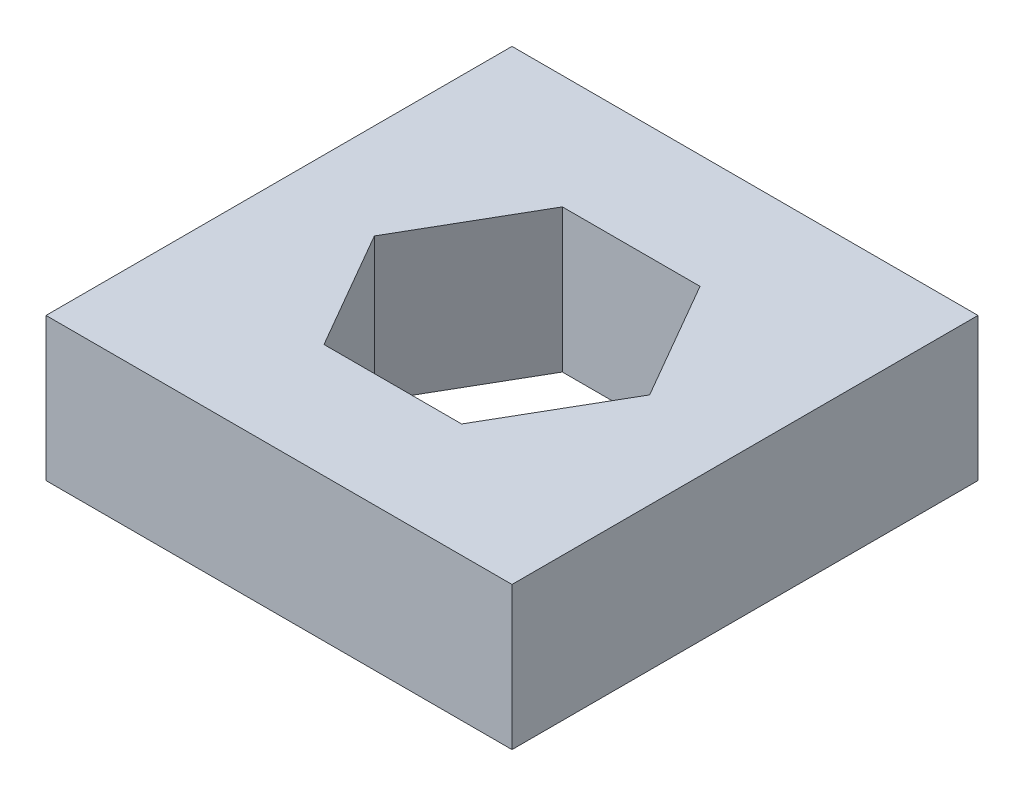
ISO-10303-21;
HEADER;
FILE_DESCRIPTION(('STEP AP214'),'2;1');
FILE_NAME('part.step','',(''),(''),'','','');
FILE_SCHEMA(('AUTOMOTIVE_DESIGN { 1 0 10303 214 1 1 1 1 }'));
ENDSEC;
DATA;
#1=APPLICATION_CONTEXT('core data for automotive mechanical design processes');
#2=APPLICATION_PROTOCOL_DEFINITION('international standard','automotive_design',2000,#1);
#3=PRODUCT_CONTEXT('',#1,'mechanical');
#4=PRODUCT('Part','Part','',(#3));
#5=PRODUCT_RELATED_PRODUCT_CATEGORY('part','',(#4));
#6=PRODUCT_DEFINITION_FORMATION('','',#4);
#7=PRODUCT_DEFINITION_CONTEXT('part definition',#1,'design');
#8=PRODUCT_DEFINITION('design','',#6,#7);
#9=PRODUCT_DEFINITION_SHAPE('','',#8);
#10=(LENGTH_UNIT() NAMED_UNIT(*) SI_UNIT(.MILLI.,.METRE.));
#11=(NAMED_UNIT(*) PLANE_ANGLE_UNIT() SI_UNIT($,.RADIAN.));
#12=(NAMED_UNIT(*) SI_UNIT($,.STERADIAN.) SOLID_ANGLE_UNIT());
#13=UNCERTAINTY_MEASURE_WITH_UNIT(LENGTH_MEASURE(1.E-05),#10,'distance_accuracy_value','');
#14=(GEOMETRIC_REPRESENTATION_CONTEXT(3) GLOBAL_UNCERTAINTY_ASSIGNED_CONTEXT((#13)) GLOBAL_UNIT_ASSIGNED_CONTEXT((#10,
#11,#12)) REPRESENTATION_CONTEXT('',''));
#15=CARTESIAN_POINT('',(0.,0.,0.));
#16=DIRECTION('',(0.,0.,1.));
#17=DIRECTION('',(1.,0.,0.));
#18=AXIS2_PLACEMENT_3D('',#15,#16,#17);
#19=CARTESIAN_POINT('',(0.,3.,0.));
#20=DIRECTION('',(0.,-1.,0.));
#21=DIRECTION('',(0.,0.,-1.));
#22=AXIS2_PLACEMENT_3D('',#19,#20,#21);
#23=PLANE('',#22);
#24=DIRECTION('',(0.,0.,-1.));
#25=VECTOR('',#24,1.);
#26=CARTESIAN_POINT('',(4.88675134594813,3.,4.88675134594813));
#27=LINE('',#26,#25);
#28=CARTESIAN_POINT('',(4.88675134594813,3.,4.88675134594813));
#29=VERTEX_POINT('',#28);
#30=CARTESIAN_POINT('',(4.88675134594813,3.,-4.88675134594813));
#31=VERTEX_POINT('',#30);
#32=EDGE_CURVE('E161',#29,#31,#27,.T.);
#33=ORIENTED_EDGE('',*,*,#32,.T.);
#34=DIRECTION('',(-1.,0.,0.));
#35=VECTOR('',#34,1.);
#36=CARTESIAN_POINT('',(-4.88675134594813,3.,-4.88675134594813));
#37=LINE('',#36,#35);
#38=CARTESIAN_POINT('',(-4.88675134594813,3.,-4.88675134594813));
#39=VERTEX_POINT('',#38);
#40=EDGE_CURVE('E164',#31,#39,#37,.T.);
#41=ORIENTED_EDGE('',*,*,#40,.T.);
#42=DIRECTION('',(0.,0.,1.));
#43=VECTOR('',#42,1.);
#44=CARTESIAN_POINT('',(-4.88675134594813,3.,4.88675134594813));
#45=LINE('',#44,#43);
#46=CARTESIAN_POINT('',(-4.88675134594813,3.,4.88675134594813));
#47=VERTEX_POINT('',#46);
#48=EDGE_CURVE('E167',#39,#47,#45,.T.);
#49=ORIENTED_EDGE('',*,*,#48,.T.);
#50=DIRECTION('',(1.,0.,0.));
#51=VECTOR('',#50,1.);
#52=CARTESIAN_POINT('',(-4.88675134594813,3.,4.88675134594813));
#53=LINE('',#52,#51);
#54=EDGE_CURVE('E169',#47,#29,#53,.T.);
#55=ORIENTED_EDGE('',*,*,#54,.T.);
#56=EDGE_LOOP('',(#33,#41,#49,#55));
#57=FACE_BOUND('',#56,.T.);
#58=DIRECTION('',(-0.5,0.,-0.866025403784439));
#59=VECTOR('',#58,1.);
#60=CARTESIAN_POINT('',(2.88675134594813,3.,0.));
#61=LINE('',#60,#59);
#62=CARTESIAN_POINT('',(2.88675134594813,3.,0.));
#63=VERTEX_POINT('',#62);
#64=CARTESIAN_POINT('',(1.44337567297406,3.,-2.5));
#65=VERTEX_POINT('',#64);
#66=EDGE_CURVE('E110',#63,#65,#61,.T.);
#67=ORIENTED_EDGE('',*,*,#66,.F.);
#68=DIRECTION('',(0.5,0.,-0.866025403784439));
#69=VECTOR('',#68,1.);
#70=CARTESIAN_POINT('',(1.44337567297406,3.,2.5));
#71=LINE('',#70,#69);
#72=CARTESIAN_POINT('',(1.44337567297406,3.,2.5));
#73=VERTEX_POINT('',#72);
#74=EDGE_CURVE('E139',#73,#63,#71,.T.);
#75=ORIENTED_EDGE('',*,*,#74,.F.);
#76=DIRECTION('',(1.,0.,0.));
#77=VECTOR('',#76,1.);
#78=CARTESIAN_POINT('',(-1.44337567297406,3.,2.5));
#79=LINE('',#78,#77);
#80=CARTESIAN_POINT('',(-1.44337567297406,3.,2.5));
#81=VERTEX_POINT('',#80);
#82=EDGE_CURVE('E137',#81,#73,#79,.T.);
#83=ORIENTED_EDGE('',*,*,#82,.F.);
#84=DIRECTION('',(0.5,0.,0.866025403784439));
#85=VECTOR('',#84,1.);
#86=CARTESIAN_POINT('',(-2.88675134594813,3.,0.));
#87=LINE('',#86,#85);
#88=CARTESIAN_POINT('',(-2.88675134594813,3.,0.));
#89=VERTEX_POINT('',#88);
#90=EDGE_CURVE('E133',#89,#81,#87,.T.);
#91=ORIENTED_EDGE('',*,*,#90,.F.);
#92=DIRECTION('',(-0.5,0.,0.866025403784439));
#93=VECTOR('',#92,1.);
#94=CARTESIAN_POINT('',(-1.44337567297406,3.,-2.5));
#95=LINE('',#94,#93);
#96=CARTESIAN_POINT('',(-1.44337567297406,3.,-2.5));
#97=VERTEX_POINT('',#96);
#98=EDGE_CURVE('E131',#97,#89,#95,.T.);
#99=ORIENTED_EDGE('',*,*,#98,.F.);
#100=DIRECTION('',(-1.,0.,0.));
#101=VECTOR('',#100,1.);
#102=CARTESIAN_POINT('',(1.44337567297406,3.,-2.5));
#103=LINE('',#102,#101);
#104=EDGE_CURVE('E118',#65,#97,#103,.T.);
#105=ORIENTED_EDGE('',*,*,#104,.F.);
#106=EDGE_LOOP('',(#67,#75,#83,#91,#99,#105));
#107=FACE_BOUND('',#106,.T.);
#108=ADVANCED_FACE('F33',(#57,#107),#23,.F.);
#109=CARTESIAN_POINT('',(0.,0.,0.));
#110=DIRECTION('',(0.,-1.,0.));
#111=DIRECTION('',(0.,0.,-1.));
#112=AXIS2_PLACEMENT_3D('',#109,#110,#111);
#113=PLANE('',#112);
#114=DIRECTION('',(0.,0.,-1.));
#115=VECTOR('',#114,1.);
#116=CARTESIAN_POINT('',(4.88675134594813,0.,4.88675134594813));
#117=LINE('',#116,#115);
#118=CARTESIAN_POINT('',(4.88675134594813,0.,4.88675134594813));
#119=VERTEX_POINT('',#118);
#120=CARTESIAN_POINT('',(4.88675134594813,0.,-4.88675134594813));
#121=VERTEX_POINT('',#120);
#122=EDGE_CURVE('E126',#119,#121,#117,.T.);
#123=ORIENTED_EDGE('',*,*,#122,.F.);
#124=DIRECTION('',(1.,0.,0.));
#125=VECTOR('',#124,1.);
#126=CARTESIAN_POINT('',(-4.88675134594813,0.,4.88675134594813));
#127=LINE('',#126,#125);
#128=CARTESIAN_POINT('',(-4.88675134594813,0.,4.88675134594813));
#129=VERTEX_POINT('',#128);
#130=EDGE_CURVE('E165',#129,#119,#127,.T.);
#131=ORIENTED_EDGE('',*,*,#130,.F.);
#132=DIRECTION('',(0.,0.,1.));
#133=VECTOR('',#132,1.);
#134=CARTESIAN_POINT('',(-4.88675134594813,0.,4.88675134594813));
#135=LINE('',#134,#133);
#136=CARTESIAN_POINT('',(-4.88675134594813,0.,-4.88675134594813));
#137=VERTEX_POINT('',#136);
#138=EDGE_CURVE('E176',#137,#129,#135,.T.);
#139=ORIENTED_EDGE('',*,*,#138,.F.);
#140=DIRECTION('',(-1.,0.,0.));
#141=VECTOR('',#140,1.);
#142=CARTESIAN_POINT('',(-4.88675134594813,0.,-4.88675134594813));
#143=LINE('',#142,#141);
#144=EDGE_CURVE('E174',#121,#137,#143,.T.);
#145=ORIENTED_EDGE('',*,*,#144,.F.);
#146=EDGE_LOOP('',(#123,#131,#139,#145));
#147=FACE_BOUND('',#146,.T.);
#148=DIRECTION('',(0.5,0.,-0.866025403784439));
#149=VECTOR('',#148,1.);
#150=CARTESIAN_POINT('',(1.44337567297406,0.,2.5));
#151=LINE('',#150,#149);
#152=CARTESIAN_POINT('',(1.44337567297406,0.,2.5));
#153=VERTEX_POINT('',#152);
#154=CARTESIAN_POINT('',(2.88675134594813,0.,0.));
#155=VERTEX_POINT('',#154);
#156=EDGE_CURVE('E119',#153,#155,#151,.T.);
#157=ORIENTED_EDGE('',*,*,#156,.T.);
#158=DIRECTION('',(-0.5,0.,-0.866025403784439));
#159=VECTOR('',#158,1.);
#160=CARTESIAN_POINT('',(2.88675134594813,0.,0.));
#161=LINE('',#160,#159);
#162=CARTESIAN_POINT('',(1.44337567297406,0.,-2.5));
#163=VERTEX_POINT('',#162);
#164=EDGE_CURVE('E56',#155,#163,#161,.T.);
#165=ORIENTED_EDGE('',*,*,#164,.T.);
#166=DIRECTION('',(-1.,0.,0.));
#167=VECTOR('',#166,1.);
#168=CARTESIAN_POINT('',(1.44337567297406,0.,-2.5));
#169=LINE('',#168,#167);
#170=CARTESIAN_POINT('',(-1.44337567297406,0.,-2.5));
#171=VERTEX_POINT('',#170);
#172=EDGE_CURVE('E125',#163,#171,#169,.T.);
#173=ORIENTED_EDGE('',*,*,#172,.T.);
#174=DIRECTION('',(-0.5,0.,0.866025403784439));
#175=VECTOR('',#174,1.);
#176=CARTESIAN_POINT('',(-1.44337567297406,0.,-2.5));
#177=LINE('',#176,#175);
#178=CARTESIAN_POINT('',(-2.88675134594813,0.,0.));
#179=VERTEX_POINT('',#178);
#180=EDGE_CURVE('E143',#171,#179,#177,.T.);
#181=ORIENTED_EDGE('',*,*,#180,.T.);
#182=DIRECTION('',(0.5,0.,0.866025403784439));
#183=VECTOR('',#182,1.);
#184=CARTESIAN_POINT('',(-2.88675134594813,0.,0.));
#185=LINE('',#184,#183);
#186=CARTESIAN_POINT('',(-1.44337567297406,0.,2.5));
#187=VERTEX_POINT('',#186);
#188=EDGE_CURVE('E146',#179,#187,#185,.T.);
#189=ORIENTED_EDGE('',*,*,#188,.T.);
#190=DIRECTION('',(1.,0.,0.));
#191=VECTOR('',#190,1.);
#192=CARTESIAN_POINT('',(-1.44337567297406,0.,2.5));
#193=LINE('',#192,#191);
#194=EDGE_CURVE('E149',#187,#153,#193,.T.);
#195=ORIENTED_EDGE('',*,*,#194,.T.);
#196=EDGE_LOOP('',(#157,#165,#173,#181,#189,#195));
#197=FACE_BOUND('',#196,.T.);
#198=ADVANCED_FACE('F194',(#147,#197),#113,.T.);
#199=CARTESIAN_POINT('',(4.88675134594813,3.,4.88675134594813));
#200=DIRECTION('',(-1.,0.,0.));
#201=DIRECTION('',(0.,0.,1.));
#202=AXIS2_PLACEMENT_3D('',#199,#200,#201);
#203=PLANE('',#202);
#204=ORIENTED_EDGE('',*,*,#122,.T.);
#205=DIRECTION('',(0.,-1.,0.));
#206=VECTOR('',#205,1.);
#207=CARTESIAN_POINT('',(4.88675134594813,3.,-4.88675134594813));
#208=LINE('',#207,#206);
#209=EDGE_CURVE('E11',#31,#121,#208,.T.);
#210=ORIENTED_EDGE('',*,*,#209,.F.);
#211=ORIENTED_EDGE('',*,*,#32,.F.);
#212=DIRECTION('',(0.,-1.,0.));
#213=VECTOR('',#212,1.);
#214=CARTESIAN_POINT('',(4.88675134594813,3.,4.88675134594813));
#215=LINE('',#214,#213);
#216=EDGE_CURVE('E171',#29,#119,#215,.T.);
#217=ORIENTED_EDGE('',*,*,#216,.T.);
#218=EDGE_LOOP('',(#204,#210,#211,#217));
#219=FACE_BOUND('',#218,.T.);
#220=ADVANCED_FACE('F35',(#219),#203,.F.);
#221=CARTESIAN_POINT('',(-4.88675134594813,3.,-4.88675134594813));
#222=DIRECTION('',(0.,0.,1.));
#223=DIRECTION('',(1.,0.,0.));
#224=AXIS2_PLACEMENT_3D('',#221,#222,#223);
#225=PLANE('',#224);
#226=ORIENTED_EDGE('',*,*,#144,.T.);
#227=DIRECTION('',(0.,-1.,0.));
#228=VECTOR('',#227,1.);
#229=CARTESIAN_POINT('',(-4.88675134594813,3.,-4.88675134594813));
#230=LINE('',#229,#228);
#231=EDGE_CURVE('E41',#39,#137,#230,.T.);
#232=ORIENTED_EDGE('',*,*,#231,.F.);
#233=ORIENTED_EDGE('',*,*,#40,.F.);
#234=ORIENTED_EDGE('',*,*,#209,.T.);
#235=EDGE_LOOP('',(#226,#232,#233,#234));
#236=FACE_BOUND('',#235,.T.);
#237=ADVANCED_FACE('F204',(#236),#225,.F.);
#238=CARTESIAN_POINT('',(-4.88675134594813,3.,4.88675134594813));
#239=DIRECTION('',(1.,0.,0.));
#240=DIRECTION('',(0.,0.,-1.));
#241=AXIS2_PLACEMENT_3D('',#238,#239,#240);
#242=PLANE('',#241);
#243=ORIENTED_EDGE('',*,*,#138,.T.);
#244=DIRECTION('',(0.,-1.,0.));
#245=VECTOR('',#244,1.);
#246=CARTESIAN_POINT('',(-4.88675134594813,3.,4.88675134594813));
#247=LINE('',#246,#245);
#248=EDGE_CURVE('E181',#47,#129,#247,.T.);
#249=ORIENTED_EDGE('',*,*,#248,.F.);
#250=ORIENTED_EDGE('',*,*,#48,.F.);
#251=ORIENTED_EDGE('',*,*,#231,.T.);
#252=EDGE_LOOP('',(#243,#249,#250,#251));
#253=FACE_BOUND('',#252,.T.);
#254=ADVANCED_FACE('F188',(#253),#242,.F.);
#255=CARTESIAN_POINT('',(-4.88675134594813,3.,4.88675134594813));
#256=DIRECTION('',(0.,0.,-1.));
#257=DIRECTION('',(-1.,0.,0.));
#258=AXIS2_PLACEMENT_3D('',#255,#256,#257);
#259=PLANE('',#258);
#260=ORIENTED_EDGE('',*,*,#130,.T.);
#261=ORIENTED_EDGE('',*,*,#216,.F.);
#262=ORIENTED_EDGE('',*,*,#54,.F.);
#263=ORIENTED_EDGE('',*,*,#248,.T.);
#264=EDGE_LOOP('',(#260,#261,#262,#263));
#265=FACE_BOUND('',#264,.T.);
#266=ADVANCED_FACE('F198',(#265),#259,.F.);
#267=CARTESIAN_POINT('',(2.88675134594813,3.,0.));
#268=DIRECTION('',(-0.866025403784438,0.,0.5));
#269=DIRECTION('',(0.5,0.,0.866025403784439));
#270=AXIS2_PLACEMENT_3D('',#267,#268,#269);
#271=PLANE('',#270);
#272=ORIENTED_EDGE('',*,*,#164,.F.);
#273=DIRECTION('',(0.,-1.,0.));
#274=VECTOR('',#273,1.);
#275=CARTESIAN_POINT('',(2.88675134594813,3.,0.));
#276=LINE('',#275,#274);
#277=EDGE_CURVE('E114',#63,#155,#276,.T.);
#278=ORIENTED_EDGE('',*,*,#277,.F.);
#279=ORIENTED_EDGE('',*,*,#66,.T.);
#280=DIRECTION('',(0.,-1.,0.));
#281=VECTOR('',#280,1.);
#282=CARTESIAN_POINT('',(1.44337567297406,3.,-2.5));
#283=LINE('',#282,#281);
#284=EDGE_CURVE('E113',#65,#163,#283,.T.);
#285=ORIENTED_EDGE('',*,*,#284,.T.);
#286=EDGE_LOOP('',(#272,#278,#279,#285));
#287=FACE_BOUND('',#286,.T.);
#288=ADVANCED_FACE('F112',(#287),#271,.T.);
#289=CARTESIAN_POINT('',(1.44337567297406,3.,-2.5));
#290=DIRECTION('',(0.,0.,1.));
#291=DIRECTION('',(1.,0.,0.));
#292=AXIS2_PLACEMENT_3D('',#289,#290,#291);
#293=PLANE('',#292);
#294=ORIENTED_EDGE('',*,*,#172,.F.);
#295=ORIENTED_EDGE('',*,*,#284,.F.);
#296=ORIENTED_EDGE('',*,*,#104,.T.);
#297=DIRECTION('',(0.,-1.,0.));
#298=VECTOR('',#297,1.);
#299=CARTESIAN_POINT('',(-1.44337567297406,3.,-2.5));
#300=LINE('',#299,#298);
#301=EDGE_CURVE('E127',#97,#171,#300,.T.);
#302=ORIENTED_EDGE('',*,*,#301,.T.);
#303=EDGE_LOOP('',(#294,#295,#296,#302));
#304=FACE_BOUND('',#303,.T.);
#305=ADVANCED_FACE('F122',(#304),#293,.T.);
#306=CARTESIAN_POINT('',(-1.44337567297406,3.,-2.5));
#307=DIRECTION('',(0.866025403784439,0.,0.5));
#308=DIRECTION('',(0.5,0.,-0.866025403784439));
#309=AXIS2_PLACEMENT_3D('',#306,#307,#308);
#310=PLANE('',#309);
#311=ORIENTED_EDGE('',*,*,#180,.F.);
#312=ORIENTED_EDGE('',*,*,#301,.F.);
#313=ORIENTED_EDGE('',*,*,#98,.T.);
#314=DIRECTION('',(0.,-1.,0.));
#315=VECTOR('',#314,1.);
#316=CARTESIAN_POINT('',(-2.88675134594813,3.,0.));
#317=LINE('',#316,#315);
#318=EDGE_CURVE('E158',#89,#179,#317,.T.);
#319=ORIENTED_EDGE('',*,*,#318,.T.);
#320=EDGE_LOOP('',(#311,#312,#313,#319));
#321=FACE_BOUND('',#320,.T.);
#322=ADVANCED_FACE('F227',(#321),#310,.T.);
#323=CARTESIAN_POINT('',(-2.88675134594813,3.,0.));
#324=DIRECTION('',(0.866025403784438,0.,-0.5));
#325=DIRECTION('',(-0.5,0.,-0.866025403784439));
#326=AXIS2_PLACEMENT_3D('',#323,#324,#325);
#327=PLANE('',#326);
#328=ORIENTED_EDGE('',*,*,#188,.F.);
#329=ORIENTED_EDGE('',*,*,#318,.F.);
#330=ORIENTED_EDGE('',*,*,#90,.T.);
#331=DIRECTION('',(0.,-1.,0.));
#332=VECTOR('',#331,1.);
#333=CARTESIAN_POINT('',(-1.44337567297406,3.,2.5));
#334=LINE('',#333,#332);
#335=EDGE_CURVE('E156',#81,#187,#334,.T.);
#336=ORIENTED_EDGE('',*,*,#335,.T.);
#337=EDGE_LOOP('',(#328,#329,#330,#336));
#338=FACE_BOUND('',#337,.T.);
#339=ADVANCED_FACE('F231',(#338),#327,.T.);
#340=CARTESIAN_POINT('',(-1.44337567297406,3.,2.5));
#341=DIRECTION('',(0.,0.,-1.));
#342=DIRECTION('',(-1.,0.,0.));
#343=AXIS2_PLACEMENT_3D('',#340,#341,#342);
#344=PLANE('',#343);
#345=ORIENTED_EDGE('',*,*,#194,.F.);
#346=ORIENTED_EDGE('',*,*,#335,.F.);
#347=ORIENTED_EDGE('',*,*,#82,.T.);
#348=DIRECTION('',(0.,-1.,0.));
#349=VECTOR('',#348,1.);
#350=CARTESIAN_POINT('',(1.44337567297406,3.,2.5));
#351=LINE('',#350,#349);
#352=EDGE_CURVE('E48',#73,#153,#351,.T.);
#353=ORIENTED_EDGE('',*,*,#352,.T.);
#354=EDGE_LOOP('',(#345,#346,#347,#353));
#355=FACE_BOUND('',#354,.T.);
#356=ADVANCED_FACE('F237',(#355),#344,.T.);
#357=CARTESIAN_POINT('',(1.44337567297406,3.,2.5));
#358=DIRECTION('',(-0.866025403784439,0.,-0.5));
#359=DIRECTION('',(-0.5,0.,0.866025403784439));
#360=AXIS2_PLACEMENT_3D('',#357,#358,#359);
#361=PLANE('',#360);
#362=ORIENTED_EDGE('',*,*,#156,.F.);
#363=ORIENTED_EDGE('',*,*,#352,.F.);
#364=ORIENTED_EDGE('',*,*,#74,.T.);
#365=ORIENTED_EDGE('',*,*,#277,.T.);
#366=EDGE_LOOP('',(#362,#363,#364,#365));
#367=FACE_BOUND('',#366,.T.);
#368=ADVANCED_FACE('F241',(#367),#361,.T.);
#369=CLOSED_SHELL('',(#108,#198,#220,#237,#254,#266,#288,#305,#322,#339,#356,#368));
#370=MANIFOLD_SOLID_BREP('B2',#369);
#371=ADVANCED_BREP_SHAPE_REPRESENTATION('',(#18,#370),#14);
#372=SHAPE_DEFINITION_REPRESENTATION(#9,#371);
ENDSEC;
END-ISO-10303-21;
